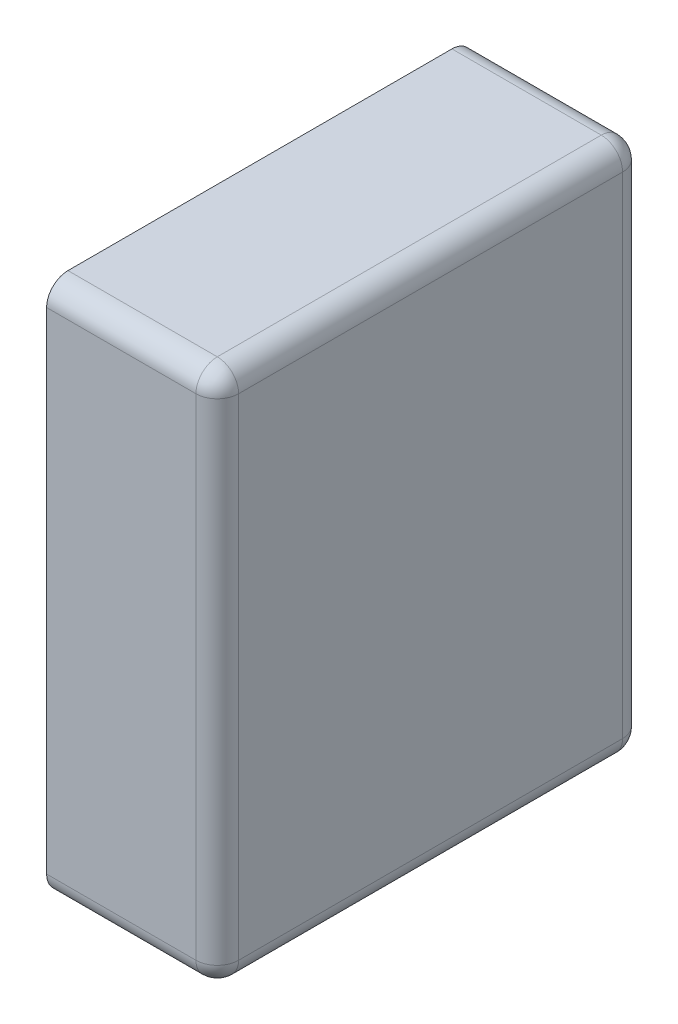
ISO-10303-21;
HEADER;
FILE_DESCRIPTION(('STEP AP214'),'2;1');
FILE_NAME('part.step','',(''),(''),'','','');
FILE_SCHEMA(('AUTOMOTIVE_DESIGN { 1 0 10303 214 1 1 1 1 }'));
ENDSEC;
DATA;
#1=APPLICATION_CONTEXT('core data for automotive mechanical design processes');
#2=APPLICATION_PROTOCOL_DEFINITION('international standard','automotive_design',2000,#1);
#3=PRODUCT_CONTEXT('',#1,'mechanical');
#4=PRODUCT('Part','Part','',(#3));
#5=PRODUCT_RELATED_PRODUCT_CATEGORY('part','',(#4));
#6=PRODUCT_DEFINITION_FORMATION('','',#4);
#7=PRODUCT_DEFINITION_CONTEXT('part definition',#1,'design');
#8=PRODUCT_DEFINITION('design','',#6,#7);
#9=PRODUCT_DEFINITION_SHAPE('','',#8);
#10=(LENGTH_UNIT() NAMED_UNIT(*) SI_UNIT(.MILLI.,.METRE.));
#11=(NAMED_UNIT(*) PLANE_ANGLE_UNIT() SI_UNIT($,.RADIAN.));
#12=(NAMED_UNIT(*) SI_UNIT($,.STERADIAN.) SOLID_ANGLE_UNIT());
#13=UNCERTAINTY_MEASURE_WITH_UNIT(LENGTH_MEASURE(1.E-05),#10,'distance_accuracy_value','');
#14=(GEOMETRIC_REPRESENTATION_CONTEXT(3) GLOBAL_UNCERTAINTY_ASSIGNED_CONTEXT((#13)) GLOBAL_UNIT_ASSIGNED_CONTEXT((#10,
#11,#12)) REPRESENTATION_CONTEXT('',''));
#15=CARTESIAN_POINT('',(0.,0.,0.));
#16=DIRECTION('',(0.,0.,1.));
#17=DIRECTION('',(1.,0.,0.));
#18=AXIS2_PLACEMENT_3D('',#15,#16,#17);
#19=CARTESIAN_POINT('',(2.,0.,0.));
#20=DIRECTION('',(1.,0.,0.));
#21=DIRECTION('',(0.,0.,-1.));
#22=AXIS2_PLACEMENT_3D('',#19,#20,#21);
#23=PLANE('',#22);
#24=DIRECTION('',(0.,0.,1.));
#25=VECTOR('',#24,1.);
#26=CARTESIAN_POINT('',(2.,1.2,0.));
#27=LINE('',#26,#25);
#28=CARTESIAN_POINT('',(2.,1.2,0.95));
#29=VERTEX_POINT('',#28);
#30=CARTESIAN_POINT('',(2.,1.2,0.05));
#31=VERTEX_POINT('',#30);
#32=EDGE_CURVE('E175',#29,#31,#27,.F.);
#33=ORIENTED_EDGE('',*,*,#32,.F.);
#34=DIRECTION('',(0.,1.,0.));
#35=VECTOR('',#34,1.);
#36=CARTESIAN_POINT('',(2.,0.,0.95));
#37=LINE('',#36,#35);
#38=CARTESIAN_POINT('',(2.,0.05,0.95));
#39=VERTEX_POINT('',#38);
#40=EDGE_CURVE('E165',#39,#29,#37,.T.);
#41=ORIENTED_EDGE('',*,*,#40,.F.);
#42=DIRECTION('',(0.,0.,1.));
#43=VECTOR('',#42,1.);
#44=CARTESIAN_POINT('',(2.,0.05,0.));
#45=LINE('',#44,#43);
#46=CARTESIAN_POINT('',(2.,0.05,0.05));
#47=VERTEX_POINT('',#46);
#48=EDGE_CURVE('E211',#47,#39,#45,.T.);
#49=ORIENTED_EDGE('',*,*,#48,.F.);
#50=DIRECTION('',(0.,1.,0.));
#51=VECTOR('',#50,1.);
#52=CARTESIAN_POINT('',(2.,0.,0.05));
#53=LINE('',#52,#51);
#54=EDGE_CURVE('E227',#31,#47,#53,.F.);
#55=ORIENTED_EDGE('',*,*,#54,.F.);
#56=EDGE_LOOP('',(#33,#41,#49,#55));
#57=FACE_BOUND('',#56,.T.);
#58=ADVANCED_FACE('F17',(#57),#23,.T.);
#59=CARTESIAN_POINT('',(1.95,0.05,0.));
#60=DIRECTION('',(0.,0.,1.));
#61=DIRECTION('',(1.,0.,0.));
#62=AXIS2_PLACEMENT_3D('',#59,#60,#61);
#63=CYLINDRICAL_SURFACE('',#62,0.05);
#64=CARTESIAN_POINT('',(1.95,0.05,0.05));
#65=DIRECTION('',(0.,-9.5846697953635E-13,-1.));
#66=DIRECTION('',(1.,0.,0.));
#67=AXIS2_PLACEMENT_3D('',#64,#65,#66);
#68=CIRCLE('',#67,0.05);
#69=CARTESIAN_POINT('',(1.95,0.,0.050000000000012));
#70=VERTEX_POINT('',#69);
#71=EDGE_CURVE('E207',#47,#70,#68,.T.);
#72=ORIENTED_EDGE('',*,*,#71,.F.);
#73=ORIENTED_EDGE('',*,*,#48,.T.);
#74=CARTESIAN_POINT('',(1.95,0.05,0.95));
#75=DIRECTION('',(0.,0.,-1.));
#76=DIRECTION('',(1.,0.,0.));
#77=AXIS2_PLACEMENT_3D('',#74,#75,#76);
#78=CIRCLE('',#77,0.05);
#79=CARTESIAN_POINT('',(1.95,0.,0.95));
#80=VERTEX_POINT('',#79);
#81=EDGE_CURVE('E284',#80,#39,#78,.F.);
#82=ORIENTED_EDGE('',*,*,#81,.F.);
#83=DIRECTION('',(0.,0.,1.));
#84=VECTOR('',#83,1.);
#85=CARTESIAN_POINT('',(1.95,0.,0.));
#86=LINE('',#85,#84);
#87=EDGE_CURVE('E289',#80,#70,#86,.F.);
#88=ORIENTED_EDGE('',*,*,#87,.T.);
#89=EDGE_LOOP('',(#72,#73,#82,#88));
#90=FACE_BOUND('',#89,.T.);
#91=ADVANCED_FACE('F200',(#90),#63,.T.);
#92=CARTESIAN_POINT('',(1.95,0.05,0.05));
#93=DIRECTION('',(1.,0.,0.));
#94=DIRECTION('',(0.,1.,0.));
#95=AXIS2_PLACEMENT_3D('',#92,#93,#94);
#96=SPHERICAL_SURFACE('',#95,0.05);
#97=CARTESIAN_POINT('',(1.95,0.05,0.05));
#98=DIRECTION('',(1.,0.,0.));
#99=DIRECTION('',(0.,0.,-1.));
#100=AXIS2_PLACEMENT_3D('',#97,#98,#99);
#101=CIRCLE('',#100,0.05);
#102=CARTESIAN_POINT('',(1.95,0.05,0.));
#103=VERTEX_POINT('',#102);
#104=EDGE_CURVE('E124',#103,#70,#101,.F.);
#105=ORIENTED_EDGE('',*,*,#104,.F.);
#106=CARTESIAN_POINT('',(1.95,0.05,0.05));
#107=DIRECTION('',(0.,1.,0.));
#108=DIRECTION('',(0.,0.,1.));
#109=AXIS2_PLACEMENT_3D('',#106,#107,#108);
#110=CIRCLE('',#109,0.05);
#111=EDGE_CURVE('E210',#47,#103,#110,.T.);
#112=ORIENTED_EDGE('',*,*,#111,.F.);
#113=ORIENTED_EDGE('',*,*,#71,.T.);
#114=EDGE_LOOP('',(#105,#112,#113));
#115=FACE_BOUND('',#114,.T.);
#116=ADVANCED_FACE('F196',(#115),#96,.T.);
#117=CARTESIAN_POINT('',(1.95,0.,0.05));
#118=DIRECTION('',(0.,1.,0.));
#119=DIRECTION('',(0.,0.,1.));
#120=AXIS2_PLACEMENT_3D('',#117,#118,#119);
#121=CYLINDRICAL_SURFACE('',#120,0.05);
#122=CARTESIAN_POINT('',(1.95,1.2,0.0499999999999999));
#123=DIRECTION('',(0.,1.,0.));
#124=DIRECTION('',(1.,0.,0.));
#125=AXIS2_PLACEMENT_3D('',#122,#123,#124);
#126=CIRCLE('',#125,0.05);
#127=CARTESIAN_POINT('',(1.95,1.2,0.));
#128=VERTEX_POINT('',#127);
#129=EDGE_CURVE('E187',#31,#128,#126,.T.);
#130=ORIENTED_EDGE('',*,*,#129,.F.);
#131=ORIENTED_EDGE('',*,*,#54,.T.);
#132=ORIENTED_EDGE('',*,*,#111,.T.);
#133=DIRECTION('',(0.,1.,0.));
#134=VECTOR('',#133,1.);
#135=CARTESIAN_POINT('',(1.95,0.,0.));
#136=LINE('',#135,#134);
#137=EDGE_CURVE('E74',#103,#128,#136,.T.);
#138=ORIENTED_EDGE('',*,*,#137,.T.);
#139=EDGE_LOOP('',(#130,#131,#132,#138));
#140=FACE_BOUND('',#139,.T.);
#141=ADVANCED_FACE('F192',(#140),#121,.T.);
#142=CARTESIAN_POINT('',(1.95,1.2,0.05));
#143=DIRECTION('',(1.,0.,0.));
#144=DIRECTION('',(0.,1.,0.));
#145=AXIS2_PLACEMENT_3D('',#142,#143,#144);
#146=SPHERICAL_SURFACE('',#145,0.05);
#147=CARTESIAN_POINT('',(1.95,1.2,0.05));
#148=DIRECTION('',(1.,0.,0.));
#149=DIRECTION('',(0.,0.,-1.));
#150=AXIS2_PLACEMENT_3D('',#147,#148,#149);
#151=CIRCLE('',#150,0.05);
#152=CARTESIAN_POINT('',(1.95,1.25,0.05));
#153=VERTEX_POINT('',#152);
#154=EDGE_CURVE('E118',#153,#128,#151,.F.);
#155=ORIENTED_EDGE('',*,*,#154,.F.);
#156=CARTESIAN_POINT('',(1.95,1.2,0.05));
#157=DIRECTION('',(0.,0.,1.));
#158=DIRECTION('',(1.,0.,0.));
#159=AXIS2_PLACEMENT_3D('',#156,#157,#158);
#160=CIRCLE('',#159,0.05);
#161=EDGE_CURVE('E166',#31,#153,#160,.T.);
#162=ORIENTED_EDGE('',*,*,#161,.F.);
#163=ORIENTED_EDGE('',*,*,#129,.T.);
#164=EDGE_LOOP('',(#155,#162,#163));
#165=FACE_BOUND('',#164,.T.);
#166=ADVANCED_FACE('F189',(#165),#146,.T.);
#167=CARTESIAN_POINT('',(1.95,1.2,0.));
#168=DIRECTION('',(0.,0.,1.));
#169=DIRECTION('',(1.,0.,0.));
#170=AXIS2_PLACEMENT_3D('',#167,#168,#169);
#171=CYLINDRICAL_SURFACE('',#170,0.05);
#172=DIRECTION('',(0.,0.,1.));
#173=VECTOR('',#172,1.);
#174=CARTESIAN_POINT('',(1.95,1.25,0.));
#175=LINE('',#174,#173);
#176=CARTESIAN_POINT('',(1.95,1.25,0.950000000000096));
#177=VERTEX_POINT('',#176);
#178=EDGE_CURVE('E109',#177,#153,#175,.F.);
#179=ORIENTED_EDGE('',*,*,#178,.F.);
#180=CARTESIAN_POINT('',(1.95,1.2,0.95));
#181=DIRECTION('',(0.,-7.66568424341191E-12,1.));
#182=DIRECTION('',(1.,0.,0.));
#183=AXIS2_PLACEMENT_3D('',#180,#181,#182);
#184=CIRCLE('',#183,0.05);
#185=EDGE_CURVE('E162',#29,#177,#184,.T.);
#186=ORIENTED_EDGE('',*,*,#185,.F.);
#187=ORIENTED_EDGE('',*,*,#32,.T.);
#188=ORIENTED_EDGE('',*,*,#161,.T.);
#189=EDGE_LOOP('',(#179,#186,#187,#188));
#190=FACE_BOUND('',#189,.T.);
#191=ADVANCED_FACE('F154',(#190),#171,.T.);
#192=CARTESIAN_POINT('',(1.95,1.2,0.95));
#193=DIRECTION('',(1.,0.,0.));
#194=DIRECTION('',(0.,0.,1.));
#195=AXIS2_PLACEMENT_3D('',#192,#193,#194);
#196=SPHERICAL_SURFACE('',#195,0.05);
#197=CARTESIAN_POINT('',(1.95,1.2,0.95));
#198=DIRECTION('',(1.,0.,0.));
#199=DIRECTION('',(0.,0.,-1.));
#200=AXIS2_PLACEMENT_3D('',#197,#198,#199);
#201=CIRCLE('',#200,0.05);
#202=CARTESIAN_POINT('',(1.95,1.2,1.));
#203=VERTEX_POINT('',#202);
#204=EDGE_CURVE('E108',#203,#177,#201,.F.);
#205=ORIENTED_EDGE('',*,*,#204,.F.);
#206=CARTESIAN_POINT('',(1.95,1.2,0.95));
#207=DIRECTION('',(0.,1.,0.));
#208=DIRECTION('',(0.,0.,1.));
#209=AXIS2_PLACEMENT_3D('',#206,#207,#208);
#210=CIRCLE('',#209,0.05);
#211=EDGE_CURVE('E220',#29,#203,#210,.F.);
#212=ORIENTED_EDGE('',*,*,#211,.F.);
#213=ORIENTED_EDGE('',*,*,#185,.T.);
#214=EDGE_LOOP('',(#205,#212,#213));
#215=FACE_BOUND('',#214,.T.);
#216=ADVANCED_FACE('F149',(#215),#196,.T.);
#217=CARTESIAN_POINT('',(1.95,0.,0.95));
#218=DIRECTION('',(0.,1.,0.));
#219=DIRECTION('',(0.,0.,1.));
#220=AXIS2_PLACEMENT_3D('',#217,#218,#219);
#221=CYLINDRICAL_SURFACE('',#220,0.05);
#222=DIRECTION('',(0.,1.,0.));
#223=VECTOR('',#222,1.);
#224=CARTESIAN_POINT('',(1.95,0.,1.));
#225=LINE('',#224,#223);
#226=CARTESIAN_POINT('',(1.95,0.05,1.));
#227=VERTEX_POINT('',#226);
#228=EDGE_CURVE('E103',#227,#203,#225,.T.);
#229=ORIENTED_EDGE('',*,*,#228,.F.);
#230=CARTESIAN_POINT('',(1.95,0.05,0.95));
#231=DIRECTION('',(0.,-1.,0.));
#232=DIRECTION('',(1.,0.,0.));
#233=AXIS2_PLACEMENT_3D('',#230,#231,#232);
#234=CIRCLE('',#233,0.05);
#235=EDGE_CURVE('E136',#39,#227,#234,.T.);
#236=ORIENTED_EDGE('',*,*,#235,.F.);
#237=ORIENTED_EDGE('',*,*,#40,.T.);
#238=ORIENTED_EDGE('',*,*,#211,.T.);
#239=EDGE_LOOP('',(#229,#236,#237,#238));
#240=FACE_BOUND('',#239,.T.);
#241=ADVANCED_FACE('F144',(#240),#221,.T.);
#242=CARTESIAN_POINT('',(1.95,0.05,0.95));
#243=DIRECTION('',(1.,0.,0.));
#244=DIRECTION('',(0.,-1.,0.));
#245=AXIS2_PLACEMENT_3D('',#242,#243,#244);
#246=SPHERICAL_SURFACE('',#245,0.05);
#247=CARTESIAN_POINT('',(1.95,0.05,0.95));
#248=DIRECTION('',(1.,0.,0.));
#249=DIRECTION('',(0.,0.,-1.));
#250=AXIS2_PLACEMENT_3D('',#247,#248,#249);
#251=CIRCLE('',#250,0.05);
#252=EDGE_CURVE('E90',#80,#227,#251,.F.);
#253=ORIENTED_EDGE('',*,*,#252,.F.);
#254=ORIENTED_EDGE('',*,*,#81,.T.);
#255=ORIENTED_EDGE('',*,*,#235,.T.);
#256=EDGE_LOOP('',(#253,#254,#255));
#257=FACE_BOUND('',#256,.T.);
#258=ADVANCED_FACE('F139',(#257),#246,.T.);
#259=CARTESIAN_POINT('',(0.,0.,0.));
#260=DIRECTION('',(0.,1.,0.));
#261=DIRECTION('',(0.,0.,1.));
#262=AXIS2_PLACEMENT_3D('',#259,#260,#261);
#263=PLANE('',#262);
#264=DIRECTION('',(1.,0.,0.));
#265=VECTOR('',#264,1.);
#266=CARTESIAN_POINT('',(0.,0.,0.95));
#267=LINE('',#266,#265);
#268=CARTESIAN_POINT('',(1.6,0.,0.95));
#269=VERTEX_POINT('',#268);
#270=EDGE_CURVE('E96',#269,#80,#267,.T.);
#271=ORIENTED_EDGE('',*,*,#270,.F.);
#272=DIRECTION('',(0.,0.,-1.));
#273=VECTOR('',#272,1.);
#274=CARTESIAN_POINT('',(1.6,0.,0.));
#275=LINE('',#274,#273);
#276=CARTESIAN_POINT('',(1.6,0.,0.05));
#277=VERTEX_POINT('',#276);
#278=EDGE_CURVE('E86',#269,#277,#275,.T.);
#279=ORIENTED_EDGE('',*,*,#278,.T.);
#280=DIRECTION('',(1.,0.,0.));
#281=VECTOR('',#280,1.);
#282=CARTESIAN_POINT('',(0.,0.,0.05));
#283=LINE('',#282,#281);
#284=EDGE_CURVE('E60',#70,#277,#283,.F.);
#285=ORIENTED_EDGE('',*,*,#284,.F.);
#286=ORIENTED_EDGE('',*,*,#87,.F.);
#287=EDGE_LOOP('',(#271,#279,#285,#286));
#288=FACE_BOUND('',#287,.T.);
#289=ADVANCED_FACE('F143',(#288),#263,.F.);
#290=CARTESIAN_POINT('',(0.,0.05,0.05));
#291=DIRECTION('',(1.,0.,0.));
#292=DIRECTION('',(0.,0.,-1.));
#293=AXIS2_PLACEMENT_3D('',#290,#291,#292);
#294=CYLINDRICAL_SURFACE('',#293,0.05);
#295=ORIENTED_EDGE('',*,*,#104,.T.);
#296=ORIENTED_EDGE('',*,*,#284,.T.);
#297=CARTESIAN_POINT('',(1.6,0.05,0.05));
#298=DIRECTION('',(1.,0.,0.));
#299=DIRECTION('',(0.,0.,-1.));
#300=AXIS2_PLACEMENT_3D('',#297,#298,#299);
#301=CIRCLE('',#300,0.05);
#302=CARTESIAN_POINT('',(1.6,0.05,0.));
#303=VERTEX_POINT('',#302);
#304=EDGE_CURVE('E20',#277,#303,#301,.T.);
#305=ORIENTED_EDGE('',*,*,#304,.T.);
#306=DIRECTION('',(1.,0.,0.));
#307=VECTOR('',#306,1.);
#308=CARTESIAN_POINT('',(0.,0.05,0.));
#309=LINE('',#308,#307);
#310=EDGE_CURVE('E67',#303,#103,#309,.T.);
#311=ORIENTED_EDGE('',*,*,#310,.T.);
#312=EDGE_LOOP('',(#295,#296,#305,#311));
#313=FACE_BOUND('',#312,.T.);
#314=ADVANCED_FACE('F85',(#313),#294,.T.);
#315=CARTESIAN_POINT('',(0.,0.,0.));
#316=DIRECTION('',(0.,0.,1.));
#317=DIRECTION('',(1.,0.,0.));
#318=AXIS2_PLACEMENT_3D('',#315,#316,#317);
#319=PLANE('',#318);
#320=ORIENTED_EDGE('',*,*,#137,.F.);
#321=ORIENTED_EDGE('',*,*,#310,.F.);
#322=DIRECTION('',(0.,1.,0.));
#323=VECTOR('',#322,1.);
#324=CARTESIAN_POINT('',(1.6,0.,0.));
#325=LINE('',#324,#323);
#326=CARTESIAN_POINT('',(1.6,1.2,0.));
#327=VERTEX_POINT('',#326);
#328=EDGE_CURVE('E71',#303,#327,#325,.T.);
#329=ORIENTED_EDGE('',*,*,#328,.T.);
#330=DIRECTION('',(1.,0.,0.));
#331=VECTOR('',#330,1.);
#332=CARTESIAN_POINT('',(0.,1.2,0.));
#333=LINE('',#332,#331);
#334=EDGE_CURVE('E114',#128,#327,#333,.F.);
#335=ORIENTED_EDGE('',*,*,#334,.F.);
#336=EDGE_LOOP('',(#320,#321,#329,#335));
#337=FACE_BOUND('',#336,.T.);
#338=ADVANCED_FACE('F69',(#337),#319,.F.);
#339=CARTESIAN_POINT('',(0.,1.2,0.05));
#340=DIRECTION('',(1.,0.,0.));
#341=DIRECTION('',(0.,0.,-1.));
#342=AXIS2_PLACEMENT_3D('',#339,#340,#341);
#343=CYLINDRICAL_SURFACE('',#342,0.05);
#344=ORIENTED_EDGE('',*,*,#334,.T.);
#345=CARTESIAN_POINT('',(1.6,1.2,0.05));
#346=DIRECTION('',(1.,0.,0.));
#347=DIRECTION('',(0.,0.,-1.));
#348=AXIS2_PLACEMENT_3D('',#345,#346,#347);
#349=CIRCLE('',#348,0.05);
#350=CARTESIAN_POINT('',(1.6,1.25,0.05));
#351=VERTEX_POINT('',#350);
#352=EDGE_CURVE('E83',#327,#351,#349,.T.);
#353=ORIENTED_EDGE('',*,*,#352,.T.);
#354=DIRECTION('',(1.,0.,0.));
#355=VECTOR('',#354,1.);
#356=CARTESIAN_POINT('',(0.,1.25,0.05));
#357=LINE('',#356,#355);
#358=EDGE_CURVE('E112',#153,#351,#357,.F.);
#359=ORIENTED_EDGE('',*,*,#358,.F.);
#360=ORIENTED_EDGE('',*,*,#154,.T.);
#361=EDGE_LOOP('',(#344,#353,#359,#360));
#362=FACE_BOUND('',#361,.T.);
#363=ADVANCED_FACE('F312',(#362),#343,.T.);
#364=CARTESIAN_POINT('',(0.,1.25,0.));
#365=DIRECTION('',(0.,1.,0.));
#366=DIRECTION('',(0.,0.,1.));
#367=AXIS2_PLACEMENT_3D('',#364,#365,#366);
#368=PLANE('',#367);
#369=DIRECTION('',(1.,0.,0.));
#370=VECTOR('',#369,1.);
#371=CARTESIAN_POINT('',(0.,1.25,0.95));
#372=LINE('',#371,#370);
#373=CARTESIAN_POINT('',(1.6,1.25,0.95));
#374=VERTEX_POINT('',#373);
#375=EDGE_CURVE('E106',#177,#374,#372,.F.);
#376=ORIENTED_EDGE('',*,*,#375,.F.);
#377=ORIENTED_EDGE('',*,*,#178,.T.);
#378=ORIENTED_EDGE('',*,*,#358,.T.);
#379=DIRECTION('',(0.,0.,-1.));
#380=VECTOR('',#379,1.);
#381=CARTESIAN_POINT('',(1.6,1.25,0.));
#382=LINE('',#381,#380);
#383=EDGE_CURVE('E234',#351,#374,#382,.F.);
#384=ORIENTED_EDGE('',*,*,#383,.T.);
#385=EDGE_LOOP('',(#376,#377,#378,#384));
#386=FACE_BOUND('',#385,.T.);
#387=ADVANCED_FACE('F252',(#386),#368,.T.);
#388=CARTESIAN_POINT('',(0.,1.2,0.95));
#389=DIRECTION('',(1.,0.,0.));
#390=DIRECTION('',(0.,0.,-1.));
#391=AXIS2_PLACEMENT_3D('',#388,#389,#390);
#392=CYLINDRICAL_SURFACE('',#391,0.05);
#393=DIRECTION('',(1.,0.,0.));
#394=VECTOR('',#393,1.);
#395=CARTESIAN_POINT('',(0.,1.2,1.));
#396=LINE('',#395,#394);
#397=CARTESIAN_POINT('',(1.6,1.2,1.));
#398=VERTEX_POINT('',#397);
#399=EDGE_CURVE('E99',#203,#398,#396,.F.);
#400=ORIENTED_EDGE('',*,*,#399,.F.);
#401=ORIENTED_EDGE('',*,*,#204,.T.);
#402=ORIENTED_EDGE('',*,*,#375,.T.);
#403=CARTESIAN_POINT('',(1.6,1.2,0.95));
#404=DIRECTION('',(1.,0.,0.));
#405=DIRECTION('',(0.,0.,-1.));
#406=AXIS2_PLACEMENT_3D('',#403,#404,#405);
#407=CIRCLE('',#406,0.05);
#408=EDGE_CURVE('E232',#374,#398,#407,.T.);
#409=ORIENTED_EDGE('',*,*,#408,.T.);
#410=EDGE_LOOP('',(#400,#401,#402,#409));
#411=FACE_BOUND('',#410,.T.);
#412=ADVANCED_FACE('F247',(#411),#392,.T.);
#413=CARTESIAN_POINT('',(0.,0.,1.));
#414=DIRECTION('',(0.,0.,1.));
#415=DIRECTION('',(1.,0.,0.));
#416=AXIS2_PLACEMENT_3D('',#413,#414,#415);
#417=PLANE('',#416);
#418=ORIENTED_EDGE('',*,*,#228,.T.);
#419=ORIENTED_EDGE('',*,*,#399,.T.);
#420=DIRECTION('',(0.,1.,0.));
#421=VECTOR('',#420,1.);
#422=CARTESIAN_POINT('',(1.6,0.,1.));
#423=LINE('',#422,#421);
#424=CARTESIAN_POINT('',(1.6,0.05,1.));
#425=VERTEX_POINT('',#424);
#426=EDGE_CURVE('E26',#398,#425,#423,.F.);
#427=ORIENTED_EDGE('',*,*,#426,.T.);
#428=DIRECTION('',(1.,0.,0.));
#429=VECTOR('',#428,1.);
#430=CARTESIAN_POINT('',(0.,0.05,1.));
#431=LINE('',#430,#429);
#432=EDGE_CURVE('E34',#227,#425,#431,.F.);
#433=ORIENTED_EDGE('',*,*,#432,.F.);
#434=EDGE_LOOP('',(#418,#419,#427,#433));
#435=FACE_BOUND('',#434,.T.);
#436=ADVANCED_FACE('F243',(#435),#417,.T.);
#437=CARTESIAN_POINT('',(0.,0.05,0.95));
#438=DIRECTION('',(1.,0.,0.));
#439=DIRECTION('',(0.,0.,-1.));
#440=AXIS2_PLACEMENT_3D('',#437,#438,#439);
#441=CYLINDRICAL_SURFACE('',#440,0.05);
#442=ORIENTED_EDGE('',*,*,#432,.T.);
#443=CARTESIAN_POINT('',(1.6,0.05,0.95));
#444=DIRECTION('',(1.,0.,0.));
#445=DIRECTION('',(0.,0.,-1.));
#446=AXIS2_PLACEMENT_3D('',#443,#444,#445);
#447=CIRCLE('',#446,0.05);
#448=EDGE_CURVE('E11',#425,#269,#447,.T.);
#449=ORIENTED_EDGE('',*,*,#448,.T.);
#450=ORIENTED_EDGE('',*,*,#270,.T.);
#451=ORIENTED_EDGE('',*,*,#252,.T.);
#452=EDGE_LOOP('',(#442,#449,#450,#451));
#453=FACE_BOUND('',#452,.T.);
#454=ADVANCED_FACE('F323',(#453),#441,.T.);
#455=CARTESIAN_POINT('',(1.6,0.,0.));
#456=DIRECTION('',(1.,0.,0.));
#457=DIRECTION('',(0.,0.,-1.));
#458=AXIS2_PLACEMENT_3D('',#455,#456,#457);
#459=PLANE('',#458);
#460=ORIENTED_EDGE('',*,*,#426,.F.);
#461=ORIENTED_EDGE('',*,*,#408,.F.);
#462=ORIENTED_EDGE('',*,*,#383,.F.);
#463=ORIENTED_EDGE('',*,*,#352,.F.);
#464=ORIENTED_EDGE('',*,*,#328,.F.);
#465=ORIENTED_EDGE('',*,*,#304,.F.);
#466=ORIENTED_EDGE('',*,*,#278,.F.);
#467=ORIENTED_EDGE('',*,*,#448,.F.);
#468=EDGE_LOOP('',(#460,#461,#462,#463,#464,#465,#466,#467));
#469=FACE_BOUND('',#468,.T.);
#470=ADVANCED_FACE('F79',(#469),#459,.F.);
#471=CLOSED_SHELL('',(#58,#91,#116,#141,#166,#191,#216,#241,#258,#289,#314,#338,#363,#387,#412,
#436,#454,#470));
#472=MANIFOLD_SOLID_BREP('B1',#471);
#473=ADVANCED_BREP_SHAPE_REPRESENTATION('',(#18,#472),#14);
#474=SHAPE_DEFINITION_REPRESENTATION(#9,#473);
ENDSEC;
END-ISO-10303-21;
